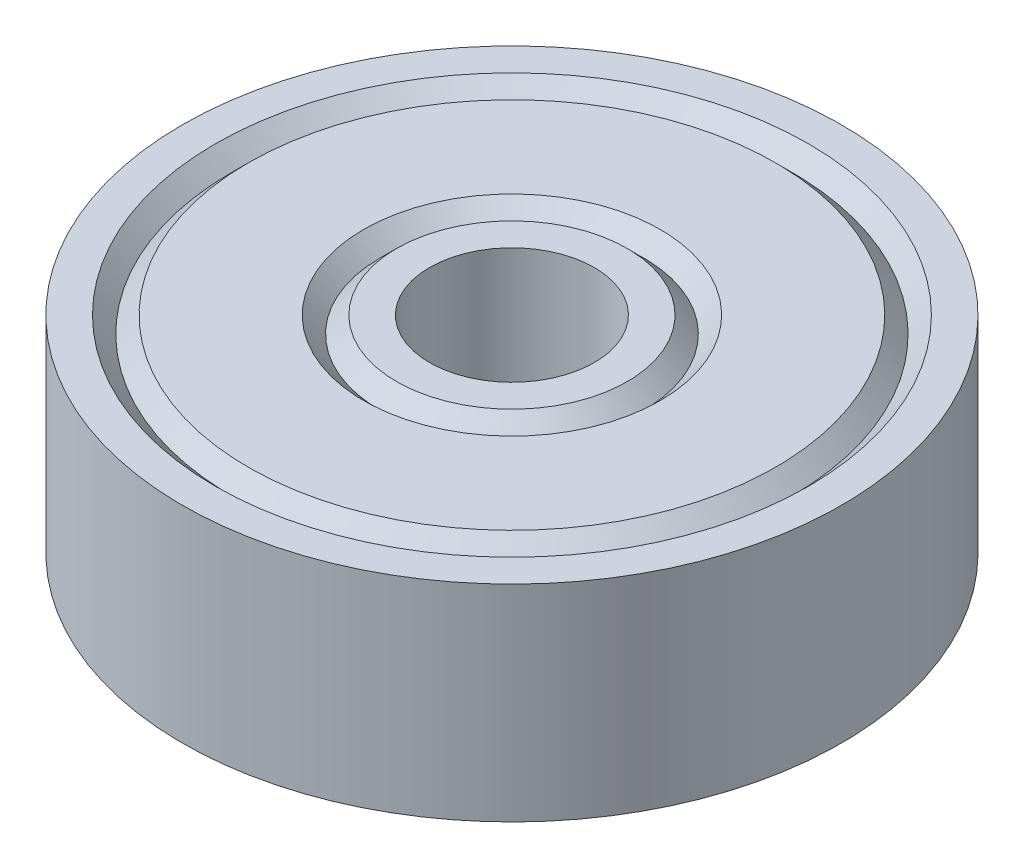
ISO-10303-21;
HEADER;
FILE_DESCRIPTION(('STEP AP214'),'2;1');
FILE_NAME('part.step','',(''),(''),'','','');
FILE_SCHEMA(('AUTOMOTIVE_DESIGN { 1 0 10303 214 1 1 1 1 }'));
ENDSEC;
DATA;
#1=APPLICATION_CONTEXT('core data for automotive mechanical design processes');
#2=APPLICATION_PROTOCOL_DEFINITION('international standard','automotive_design',2000,#1);
#3=PRODUCT_CONTEXT('',#1,'mechanical');
#4=PRODUCT('Part','Part','',(#3));
#5=PRODUCT_RELATED_PRODUCT_CATEGORY('part','',(#4));
#6=PRODUCT_DEFINITION_FORMATION('','',#4);
#7=PRODUCT_DEFINITION_CONTEXT('part definition',#1,'design');
#8=PRODUCT_DEFINITION('design','',#6,#7);
#9=PRODUCT_DEFINITION_SHAPE('','',#8);
#10=(LENGTH_UNIT() NAMED_UNIT(*) SI_UNIT(.MILLI.,.METRE.));
#11=(NAMED_UNIT(*) PLANE_ANGLE_UNIT() SI_UNIT($,.RADIAN.));
#12=(NAMED_UNIT(*) SI_UNIT($,.STERADIAN.) SOLID_ANGLE_UNIT());
#13=UNCERTAINTY_MEASURE_WITH_UNIT(LENGTH_MEASURE(1.E-05),#10,'distance_accuracy_value','');
#14=(GEOMETRIC_REPRESENTATION_CONTEXT(3) GLOBAL_UNCERTAINTY_ASSIGNED_CONTEXT((#13)) GLOBAL_UNIT_ASSIGNED_CONTEXT((#10,
#11,#12)) REPRESENTATION_CONTEXT('',''));
#15=CARTESIAN_POINT('',(0.,0.,0.));
#16=DIRECTION('',(0.,0.,1.));
#17=DIRECTION('',(1.,0.,0.));
#18=AXIS2_PLACEMENT_3D('',#15,#16,#17);
#19=CARTESIAN_POINT('',(0.,2.5,0.));
#20=DIRECTION('',(0.,1.,0.));
#21=DIRECTION('',(-1.,0.,0.));
#22=AXIS2_PLACEMENT_3D('',#19,#20,#21);
#23=CYLINDRICAL_SURFACE('',#22,2.);
#24=CARTESIAN_POINT('',(0.,2.5,0.));
#25=DIRECTION('',(0.,1.,0.));
#26=DIRECTION('',(-1.,0.,0.));
#27=AXIS2_PLACEMENT_3D('',#24,#25,#26);
#28=CIRCLE('',#27,2.);
#29=CARTESIAN_POINT('',(-2.,2.5,0.));
#30=VERTEX_POINT('',#29);
#31=EDGE_CURVE('E83',#30,#30,#28,.T.);
#32=ORIENTED_EDGE('',*,*,#31,.T.);
#33=EDGE_LOOP('',(#32));
#34=FACE_BOUND('',#33,.T.);
#35=CARTESIAN_POINT('',(0.,-2.5,0.));
#36=DIRECTION('',(0.,1.,0.));
#37=DIRECTION('',(-1.,0.,0.));
#38=AXIS2_PLACEMENT_3D('',#35,#36,#37);
#39=CIRCLE('',#38,2.);
#40=CARTESIAN_POINT('',(-2.,-2.5,0.));
#41=VERTEX_POINT('',#40);
#42=EDGE_CURVE('E10',#41,#41,#39,.T.);
#43=ORIENTED_EDGE('',*,*,#42,.F.);
#44=EDGE_LOOP('',(#43));
#45=FACE_BOUND('',#44,.T.);
#46=ADVANCED_FACE('F31',(#34,#45),#23,.F.);
#47=CARTESIAN_POINT('',(-2.,-2.5,0.));
#48=DIRECTION('',(0.,-1.,0.));
#49=DIRECTION('',(1.,0.,0.));
#50=AXIS2_PLACEMENT_3D('',#47,#48,#49);
#51=PLANE('',#50);
#52=ORIENTED_EDGE('',*,*,#42,.T.);
#53=EDGE_LOOP('',(#52));
#54=FACE_BOUND('',#53,.T.);
#55=CARTESIAN_POINT('',(0.,-2.5,0.));
#56=DIRECTION('',(0.,1.,0.));
#57=DIRECTION('',(-1.,0.,0.));
#58=AXIS2_PLACEMENT_3D('',#55,#56,#57);
#59=CIRCLE('',#58,2.8);
#60=CARTESIAN_POINT('',(-2.8,-2.5,0.));
#61=VERTEX_POINT('',#60);
#62=EDGE_CURVE('E37',#61,#61,#59,.T.);
#63=ORIENTED_EDGE('',*,*,#62,.F.);
#64=EDGE_LOOP('',(#63));
#65=FACE_BOUND('',#64,.T.);
#66=ADVANCED_FACE('F101',(#54,#65),#51,.T.);
#67=CARTESIAN_POINT('',(0.,-2.1,0.));
#68=DIRECTION('',(0.,1.,0.));
#69=DIRECTION('',(-1.,0.,0.));
#70=AXIS2_PLACEMENT_3D('',#67,#68,#69);
#71=CONICAL_SURFACE('',#70,3.2,0.785398163397449);
#72=ORIENTED_EDGE('',*,*,#62,.T.);
#73=EDGE_LOOP('',(#72));
#74=FACE_BOUND('',#73,.T.);
#75=CARTESIAN_POINT('',(0.,-2.1,0.));
#76=DIRECTION('',(0.,1.,0.));
#77=DIRECTION('',(-1.,0.,0.));
#78=AXIS2_PLACEMENT_3D('',#75,#76,#77);
#79=CIRCLE('',#78,3.2);
#80=CARTESIAN_POINT('',(-3.2,-2.1,0.));
#81=VERTEX_POINT('',#80);
#82=EDGE_CURVE('E41',#81,#81,#79,.T.);
#83=ORIENTED_EDGE('',*,*,#82,.F.);
#84=EDGE_LOOP('',(#83));
#85=FACE_BOUND('',#84,.T.);
#86=ADVANCED_FACE('F105',(#74,#85),#71,.T.);
#87=CARTESIAN_POINT('',(0.,-2.5,0.));
#88=DIRECTION('',(0.,-1.,0.));
#89=DIRECTION('',(1.,0.,0.));
#90=AXIS2_PLACEMENT_3D('',#87,#88,#89);
#91=CONICAL_SURFACE('',#90,3.6,0.785398163397449);
#92=ORIENTED_EDGE('',*,*,#82,.T.);
#93=EDGE_LOOP('',(#92));
#94=FACE_BOUND('',#93,.T.);
#95=CARTESIAN_POINT('',(0.,-2.5,0.));
#96=DIRECTION('',(0.,1.,0.));
#97=DIRECTION('',(-1.,0.,0.));
#98=AXIS2_PLACEMENT_3D('',#95,#96,#97);
#99=CIRCLE('',#98,3.6);
#100=CARTESIAN_POINT('',(-3.6,-2.5,0.));
#101=VERTEX_POINT('',#100);
#102=EDGE_CURVE('E45',#101,#101,#99,.T.);
#103=ORIENTED_EDGE('',*,*,#102,.F.);
#104=EDGE_LOOP('',(#103));
#105=FACE_BOUND('',#104,.T.);
#106=ADVANCED_FACE('F109',(#94,#105),#91,.F.);
#107=CARTESIAN_POINT('',(-3.6,-2.5,0.));
#108=DIRECTION('',(0.,-1.,0.));
#109=DIRECTION('',(1.,0.,0.));
#110=AXIS2_PLACEMENT_3D('',#107,#108,#109);
#111=PLANE('',#110);
#112=ORIENTED_EDGE('',*,*,#102,.T.);
#113=EDGE_LOOP('',(#112));
#114=FACE_BOUND('',#113,.T.);
#115=CARTESIAN_POINT('',(0.,-2.5,0.));
#116=DIRECTION('',(0.,1.,0.));
#117=DIRECTION('',(-1.,0.,0.));
#118=AXIS2_PLACEMENT_3D('',#115,#116,#117);
#119=CIRCLE('',#118,6.4);
#120=CARTESIAN_POINT('',(-6.4,-2.5,0.));
#121=VERTEX_POINT('',#120);
#122=EDGE_CURVE('E50',#121,#121,#119,.T.);
#123=ORIENTED_EDGE('',*,*,#122,.F.);
#124=EDGE_LOOP('',(#123));
#125=FACE_BOUND('',#124,.T.);
#126=ADVANCED_FACE('F115',(#114,#125),#111,.T.);
#127=CARTESIAN_POINT('',(0.,-2.1,0.));
#128=DIRECTION('',(0.,1.,0.));
#129=DIRECTION('',(-1.,0.,0.));
#130=AXIS2_PLACEMENT_3D('',#127,#128,#129);
#131=CONICAL_SURFACE('',#130,6.8,0.785398163397448);
#132=ORIENTED_EDGE('',*,*,#122,.T.);
#133=EDGE_LOOP('',(#132));
#134=FACE_BOUND('',#133,.T.);
#135=CARTESIAN_POINT('',(0.,-2.1,0.));
#136=DIRECTION('',(0.,1.,0.));
#137=DIRECTION('',(-1.,0.,0.));
#138=AXIS2_PLACEMENT_3D('',#135,#136,#137);
#139=CIRCLE('',#138,6.8);
#140=CARTESIAN_POINT('',(-6.8,-2.1,0.));
#141=VERTEX_POINT('',#140);
#142=EDGE_CURVE('E53',#141,#141,#139,.T.);
#143=ORIENTED_EDGE('',*,*,#142,.F.);
#144=EDGE_LOOP('',(#143));
#145=FACE_BOUND('',#144,.T.);
#146=ADVANCED_FACE('F119',(#134,#145),#131,.T.);
#147=CARTESIAN_POINT('',(0.,-2.5,0.));
#148=DIRECTION('',(0.,-1.,0.));
#149=DIRECTION('',(1.,0.,0.));
#150=AXIS2_PLACEMENT_3D('',#147,#148,#149);
#151=CONICAL_SURFACE('',#150,7.2,0.785398163397444);
#152=ORIENTED_EDGE('',*,*,#142,.T.);
#153=EDGE_LOOP('',(#152));
#154=FACE_BOUND('',#153,.T.);
#155=CARTESIAN_POINT('',(0.,-2.5,0.));
#156=DIRECTION('',(0.,1.,0.));
#157=DIRECTION('',(-1.,0.,0.));
#158=AXIS2_PLACEMENT_3D('',#155,#156,#157);
#159=CIRCLE('',#158,7.2);
#160=CARTESIAN_POINT('',(-7.2,-2.5,0.));
#161=VERTEX_POINT('',#160);
#162=EDGE_CURVE('E56',#161,#161,#159,.T.);
#163=ORIENTED_EDGE('',*,*,#162,.F.);
#164=EDGE_LOOP('',(#163));
#165=FACE_BOUND('',#164,.T.);
#166=ADVANCED_FACE('F123',(#154,#165),#151,.F.);
#167=CARTESIAN_POINT('',(-7.2,-2.5,0.));
#168=DIRECTION('',(0.,-1.,0.));
#169=DIRECTION('',(1.,0.,0.));
#170=AXIS2_PLACEMENT_3D('',#167,#168,#169);
#171=PLANE('',#170);
#172=ORIENTED_EDGE('',*,*,#162,.T.);
#173=EDGE_LOOP('',(#172));
#174=FACE_BOUND('',#173,.T.);
#175=CARTESIAN_POINT('',(0.,-2.5,0.));
#176=DIRECTION('',(0.,1.,0.));
#177=DIRECTION('',(-1.,0.,0.));
#178=AXIS2_PLACEMENT_3D('',#175,#176,#177);
#179=CIRCLE('',#178,8.);
#180=CARTESIAN_POINT('',(-8.,-2.5,0.));
#181=VERTEX_POINT('',#180);
#182=EDGE_CURVE('E59',#181,#181,#179,.T.);
#183=ORIENTED_EDGE('',*,*,#182,.F.);
#184=EDGE_LOOP('',(#183));
#185=FACE_BOUND('',#184,.T.);
#186=ADVANCED_FACE('F127',(#174,#185),#171,.T.);
#187=CARTESIAN_POINT('',(0.,2.5,0.));
#188=DIRECTION('',(0.,1.,0.));
#189=DIRECTION('',(-1.,0.,0.));
#190=AXIS2_PLACEMENT_3D('',#187,#188,#189);
#191=CYLINDRICAL_SURFACE('',#190,8.);
#192=ORIENTED_EDGE('',*,*,#182,.T.);
#193=EDGE_LOOP('',(#192));
#194=FACE_BOUND('',#193,.T.);
#195=CARTESIAN_POINT('',(0.,2.5,0.));
#196=DIRECTION('',(0.,1.,0.));
#197=DIRECTION('',(-1.,0.,0.));
#198=AXIS2_PLACEMENT_3D('',#195,#196,#197);
#199=CIRCLE('',#198,8.);
#200=CARTESIAN_POINT('',(-8.,2.5,0.));
#201=VERTEX_POINT('',#200);
#202=EDGE_CURVE('E62',#201,#201,#199,.T.);
#203=ORIENTED_EDGE('',*,*,#202,.F.);
#204=EDGE_LOOP('',(#203));
#205=FACE_BOUND('',#204,.T.);
#206=ADVANCED_FACE('F131',(#194,#205),#191,.T.);
#207=CARTESIAN_POINT('',(-7.2,2.5,0.));
#208=DIRECTION('',(0.,1.,0.));
#209=DIRECTION('',(-1.,0.,0.));
#210=AXIS2_PLACEMENT_3D('',#207,#208,#209);
#211=PLANE('',#210);
#212=ORIENTED_EDGE('',*,*,#202,.T.);
#213=EDGE_LOOP('',(#212));
#214=FACE_BOUND('',#213,.T.);
#215=CARTESIAN_POINT('',(0.,2.5,0.));
#216=DIRECTION('',(0.,1.,0.));
#217=DIRECTION('',(-1.,0.,0.));
#218=AXIS2_PLACEMENT_3D('',#215,#216,#217);
#219=CIRCLE('',#218,7.2);
#220=CARTESIAN_POINT('',(-7.2,2.5,0.));
#221=VERTEX_POINT('',#220);
#222=EDGE_CURVE('E65',#221,#221,#219,.T.);
#223=ORIENTED_EDGE('',*,*,#222,.F.);
#224=EDGE_LOOP('',(#223));
#225=FACE_BOUND('',#224,.T.);
#226=ADVANCED_FACE('F135',(#214,#225),#211,.T.);
#227=CARTESIAN_POINT('',(0.,2.1,0.));
#228=DIRECTION('',(0.,1.,0.));
#229=DIRECTION('',(-1.,0.,0.));
#230=AXIS2_PLACEMENT_3D('',#227,#228,#229);
#231=CONICAL_SURFACE('',#230,6.8,0.785398163397446);
#232=ORIENTED_EDGE('',*,*,#222,.T.);
#233=EDGE_LOOP('',(#232));
#234=FACE_BOUND('',#233,.T.);
#235=CARTESIAN_POINT('',(0.,2.1,0.));
#236=DIRECTION('',(0.,1.,0.));
#237=DIRECTION('',(-1.,0.,0.));
#238=AXIS2_PLACEMENT_3D('',#235,#236,#237);
#239=CIRCLE('',#238,6.8);
#240=CARTESIAN_POINT('',(-6.8,2.1,0.));
#241=VERTEX_POINT('',#240);
#242=EDGE_CURVE('E68',#241,#241,#239,.T.);
#243=ORIENTED_EDGE('',*,*,#242,.F.);
#244=EDGE_LOOP('',(#243));
#245=FACE_BOUND('',#244,.T.);
#246=ADVANCED_FACE('F139',(#234,#245),#231,.F.);
#247=CARTESIAN_POINT('',(0.,2.5,0.));
#248=DIRECTION('',(0.,-1.,0.));
#249=DIRECTION('',(1.,0.,0.));
#250=AXIS2_PLACEMENT_3D('',#247,#248,#249);
#251=CONICAL_SURFACE('',#250,6.4,0.785398163397449);
#252=ORIENTED_EDGE('',*,*,#242,.T.);
#253=EDGE_LOOP('',(#252));
#254=FACE_BOUND('',#253,.T.);
#255=CARTESIAN_POINT('',(0.,2.5,0.));
#256=DIRECTION('',(0.,1.,0.));
#257=DIRECTION('',(-1.,0.,0.));
#258=AXIS2_PLACEMENT_3D('',#255,#256,#257);
#259=CIRCLE('',#258,6.4);
#260=CARTESIAN_POINT('',(-6.4,2.5,0.));
#261=VERTEX_POINT('',#260);
#262=EDGE_CURVE('E71',#261,#261,#259,.T.);
#263=ORIENTED_EDGE('',*,*,#262,.F.);
#264=EDGE_LOOP('',(#263));
#265=FACE_BOUND('',#264,.T.);
#266=ADVANCED_FACE('F143',(#254,#265),#251,.T.);
#267=CARTESIAN_POINT('',(-3.6,2.5,0.));
#268=DIRECTION('',(0.,1.,0.));
#269=DIRECTION('',(-1.,0.,0.));
#270=AXIS2_PLACEMENT_3D('',#267,#268,#269);
#271=PLANE('',#270);
#272=ORIENTED_EDGE('',*,*,#262,.T.);
#273=EDGE_LOOP('',(#272));
#274=FACE_BOUND('',#273,.T.);
#275=CARTESIAN_POINT('',(0.,2.5,0.));
#276=DIRECTION('',(0.,1.,0.));
#277=DIRECTION('',(-1.,0.,0.));
#278=AXIS2_PLACEMENT_3D('',#275,#276,#277);
#279=CIRCLE('',#278,3.6);
#280=CARTESIAN_POINT('',(-3.6,2.5,0.));
#281=VERTEX_POINT('',#280);
#282=EDGE_CURVE('E74',#281,#281,#279,.T.);
#283=ORIENTED_EDGE('',*,*,#282,.F.);
#284=EDGE_LOOP('',(#283));
#285=FACE_BOUND('',#284,.T.);
#286=ADVANCED_FACE('F147',(#274,#285),#271,.T.);
#287=CARTESIAN_POINT('',(0.,2.1,0.));
#288=DIRECTION('',(0.,1.,0.));
#289=DIRECTION('',(-1.,0.,0.));
#290=AXIS2_PLACEMENT_3D('',#287,#288,#289);
#291=CONICAL_SURFACE('',#290,3.2,0.785398163397448);
#292=ORIENTED_EDGE('',*,*,#282,.T.);
#293=EDGE_LOOP('',(#292));
#294=FACE_BOUND('',#293,.T.);
#295=CARTESIAN_POINT('',(0.,2.1,0.));
#296=DIRECTION('',(0.,1.,0.));
#297=DIRECTION('',(-1.,0.,0.));
#298=AXIS2_PLACEMENT_3D('',#295,#296,#297);
#299=CIRCLE('',#298,3.2);
#300=CARTESIAN_POINT('',(-3.2,2.1,0.));
#301=VERTEX_POINT('',#300);
#302=EDGE_CURVE('E77',#301,#301,#299,.T.);
#303=ORIENTED_EDGE('',*,*,#302,.F.);
#304=EDGE_LOOP('',(#303));
#305=FACE_BOUND('',#304,.T.);
#306=ADVANCED_FACE('F97',(#294,#305),#291,.F.);
#307=CARTESIAN_POINT('',(0.,2.5,0.));
#308=DIRECTION('',(0.,-1.,0.));
#309=DIRECTION('',(1.,0.,0.));
#310=AXIS2_PLACEMENT_3D('',#307,#308,#309);
#311=CONICAL_SURFACE('',#310,2.8,0.785398163397448);
#312=ORIENTED_EDGE('',*,*,#302,.T.);
#313=EDGE_LOOP('',(#312));
#314=FACE_BOUND('',#313,.T.);
#315=CARTESIAN_POINT('',(0.,2.5,0.));
#316=DIRECTION('',(0.,1.,0.));
#317=DIRECTION('',(-1.,0.,0.));
#318=AXIS2_PLACEMENT_3D('',#315,#316,#317);
#319=CIRCLE('',#318,2.8);
#320=CARTESIAN_POINT('',(-2.8,2.5,0.));
#321=VERTEX_POINT('',#320);
#322=EDGE_CURVE('E80',#321,#321,#319,.T.);
#323=ORIENTED_EDGE('',*,*,#322,.F.);
#324=EDGE_LOOP('',(#323));
#325=FACE_BOUND('',#324,.T.);
#326=ADVANCED_FACE('F91',(#314,#325),#311,.T.);
#327=CARTESIAN_POINT('',(-2.,2.5,0.));
#328=DIRECTION('',(0.,1.,0.));
#329=DIRECTION('',(-1.,0.,0.));
#330=AXIS2_PLACEMENT_3D('',#327,#328,#329);
#331=PLANE('',#330);
#332=ORIENTED_EDGE('',*,*,#322,.T.);
#333=EDGE_LOOP('',(#332));
#334=FACE_BOUND('',#333,.T.);
#335=ORIENTED_EDGE('',*,*,#31,.F.);
#336=EDGE_LOOP('',(#335));
#337=FACE_BOUND('',#336,.T.);
#338=ADVANCED_FACE('F89',(#334,#337),#331,.T.);
#339=CLOSED_SHELL('',(#46,#66,#86,#106,#126,#146,#166,#186,#206,#226,#246,#266,#286,#306,#326,#338));
#340=MANIFOLD_SOLID_BREP('B2',#339);
#341=ADVANCED_BREP_SHAPE_REPRESENTATION('',(#18,#340),#14);
#342=SHAPE_DEFINITION_REPRESENTATION(#9,#341);
ENDSEC;
END-ISO-10303-21;
